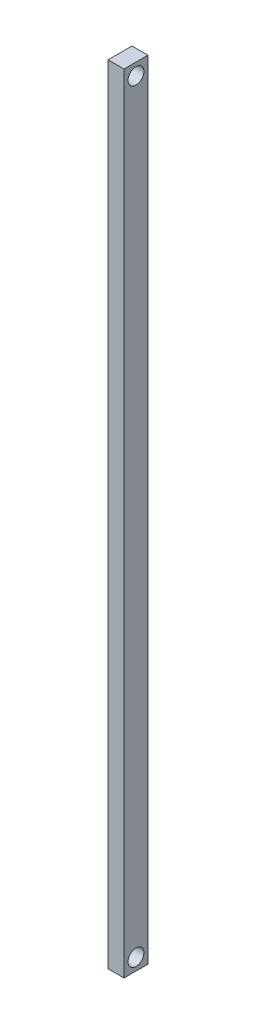
ISO-10303-21;
HEADER;
FILE_DESCRIPTION(('STEP AP214'),'2;1');
FILE_NAME('part.step','',(''),(''),'','','');
FILE_SCHEMA(('AUTOMOTIVE_DESIGN { 1 0 10303 214 1 1 1 1 }'));
ENDSEC;
DATA;
#1=APPLICATION_CONTEXT('core data for automotive mechanical design processes');
#2=APPLICATION_PROTOCOL_DEFINITION('international standard','automotive_design',2000,#1);
#3=PRODUCT_CONTEXT('',#1,'mechanical');
#4=PRODUCT('Part','Part','',(#3));
#5=PRODUCT_RELATED_PRODUCT_CATEGORY('part','',(#4));
#6=PRODUCT_DEFINITION_FORMATION('','',#4);
#7=PRODUCT_DEFINITION_CONTEXT('part definition',#1,'design');
#8=PRODUCT_DEFINITION('design','',#6,#7);
#9=PRODUCT_DEFINITION_SHAPE('','',#8);
#10=(LENGTH_UNIT() NAMED_UNIT(*) SI_UNIT(.MILLI.,.METRE.));
#11=(NAMED_UNIT(*) PLANE_ANGLE_UNIT() SI_UNIT($,.RADIAN.));
#12=(NAMED_UNIT(*) SI_UNIT($,.STERADIAN.) SOLID_ANGLE_UNIT());
#13=UNCERTAINTY_MEASURE_WITH_UNIT(LENGTH_MEASURE(1.E-05),#10,'distance_accuracy_value','');
#14=(GEOMETRIC_REPRESENTATION_CONTEXT(3) GLOBAL_UNCERTAINTY_ASSIGNED_CONTEXT((#13)) GLOBAL_UNIT_ASSIGNED_CONTEXT((#10,
#11,#12)) REPRESENTATION_CONTEXT('',''));
#15=CARTESIAN_POINT('',(0.,0.,0.));
#16=DIRECTION('',(0.,0.,1.));
#17=DIRECTION('',(1.,0.,0.));
#18=AXIS2_PLACEMENT_3D('',#15,#16,#17);
#19=CARTESIAN_POINT('',(10.,0.,15.));
#20=DIRECTION('',(0.,1.,0.));
#21=DIRECTION('',(0.,0.,1.));
#22=AXIS2_PLACEMENT_3D('',#19,#20,#21);
#23=PLANE('',#22);
#24=DIRECTION('',(0.,0.,-1.));
#25=VECTOR('',#24,1.);
#26=CARTESIAN_POINT('',(0.,0.,15.));
#27=LINE('',#26,#25);
#28=CARTESIAN_POINT('',(0.,0.,15.));
#29=VERTEX_POINT('',#28);
#30=CARTESIAN_POINT('',(0.,0.,0.));
#31=VERTEX_POINT('',#30);
#32=EDGE_CURVE('E105',#29,#31,#27,.T.);
#33=ORIENTED_EDGE('',*,*,#32,.T.);
#34=DIRECTION('',(-1.,0.,0.));
#35=VECTOR('',#34,1.);
#36=CARTESIAN_POINT('',(10.,0.,0.));
#37=LINE('',#36,#35);
#38=CARTESIAN_POINT('',(10.,0.,0.));
#39=VERTEX_POINT('',#38);
#40=EDGE_CURVE('E11',#39,#31,#37,.T.);
#41=ORIENTED_EDGE('',*,*,#40,.F.);
#42=DIRECTION('',(0.,0.,-1.));
#43=VECTOR('',#42,1.);
#44=CARTESIAN_POINT('',(10.,0.,15.));
#45=LINE('',#44,#43);
#46=CARTESIAN_POINT('',(10.,0.,15.));
#47=VERTEX_POINT('',#46);
#48=EDGE_CURVE('E89',#47,#39,#45,.T.);
#49=ORIENTED_EDGE('',*,*,#48,.F.);
#50=DIRECTION('',(-1.,0.,0.));
#51=VECTOR('',#50,1.);
#52=CARTESIAN_POINT('',(10.,0.,15.));
#53=LINE('',#52,#51);
#54=EDGE_CURVE('E98',#47,#29,#53,.T.);
#55=ORIENTED_EDGE('',*,*,#54,.T.);
#56=EDGE_LOOP('',(#33,#41,#49,#55));
#57=FACE_BOUND('',#56,.T.);
#58=ADVANCED_FACE('F39',(#57),#23,.F.);
#59=CARTESIAN_POINT('',(10.,0.,0.));
#60=DIRECTION('',(0.,0.,1.));
#61=DIRECTION('',(0.,-1.,0.));
#62=AXIS2_PLACEMENT_3D('',#59,#60,#61);
#63=PLANE('',#62);
#64=DIRECTION('',(0.,1.,0.));
#65=VECTOR('',#64,1.);
#66=CARTESIAN_POINT('',(0.,0.,0.));
#67=LINE('',#66,#65);
#68=CARTESIAN_POINT('',(0.,494.,1.20995103755759E-13));
#69=VERTEX_POINT('',#68);
#70=EDGE_CURVE('E94',#31,#69,#67,.T.);
#71=ORIENTED_EDGE('',*,*,#70,.T.);
#72=DIRECTION('',(-1.,0.,0.));
#73=VECTOR('',#72,1.);
#74=CARTESIAN_POINT('',(10.,494.,1.20995103755759E-13));
#75=LINE('',#74,#73);
#76=CARTESIAN_POINT('',(10.,494.,1.20995103755759E-13));
#77=VERTEX_POINT('',#76);
#78=EDGE_CURVE('E50',#77,#69,#75,.T.);
#79=ORIENTED_EDGE('',*,*,#78,.F.);
#80=DIRECTION('',(0.,1.,0.));
#81=VECTOR('',#80,1.);
#82=CARTESIAN_POINT('',(10.,0.,0.));
#83=LINE('',#82,#81);
#84=EDGE_CURVE('E85',#39,#77,#83,.T.);
#85=ORIENTED_EDGE('',*,*,#84,.F.);
#86=ORIENTED_EDGE('',*,*,#40,.T.);
#87=EDGE_LOOP('',(#71,#79,#85,#86));
#88=FACE_BOUND('',#87,.T.);
#89=ADVANCED_FACE('F91',(#88),#63,.F.);
#90=CARTESIAN_POINT('',(10.,494.,1.20995103755759E-13));
#91=DIRECTION('',(0.,-1.,0.));
#92=DIRECTION('',(0.,0.,-1.));
#93=AXIS2_PLACEMENT_3D('',#90,#91,#92);
#94=PLANE('',#93);
#95=DIRECTION('',(0.,0.,1.));
#96=VECTOR('',#95,1.);
#97=CARTESIAN_POINT('',(0.,494.,1.20995103755759E-13));
#98=LINE('',#97,#96);
#99=CARTESIAN_POINT('',(0.,494.,15.0000000000001));
#100=VERTEX_POINT('',#99);
#101=EDGE_CURVE('E75',#69,#100,#98,.T.);
#102=ORIENTED_EDGE('',*,*,#101,.T.);
#103=DIRECTION('',(-1.,0.,0.));
#104=VECTOR('',#103,1.);
#105=CARTESIAN_POINT('',(10.,494.,15.0000000000001));
#106=LINE('',#105,#104);
#107=CARTESIAN_POINT('',(10.,494.,15.0000000000001));
#108=VERTEX_POINT('',#107);
#109=EDGE_CURVE('E92',#108,#100,#106,.T.);
#110=ORIENTED_EDGE('',*,*,#109,.F.);
#111=DIRECTION('',(0.,0.,1.));
#112=VECTOR('',#111,1.);
#113=CARTESIAN_POINT('',(10.,494.,1.20995103755759E-13));
#114=LINE('',#113,#112);
#115=EDGE_CURVE('E86',#77,#108,#114,.T.);
#116=ORIENTED_EDGE('',*,*,#115,.F.);
#117=ORIENTED_EDGE('',*,*,#78,.T.);
#118=EDGE_LOOP('',(#102,#110,#116,#117));
#119=FACE_BOUND('',#118,.T.);
#120=ADVANCED_FACE('F96',(#119),#94,.F.);
#121=CARTESIAN_POINT('',(10.,494.,15.0000000000001));
#122=DIRECTION('',(0.,0.,-1.));
#123=DIRECTION('',(0.,1.,0.));
#124=AXIS2_PLACEMENT_3D('',#121,#122,#123);
#125=PLANE('',#124);
#126=DIRECTION('',(0.,-1.,0.));
#127=VECTOR('',#126,1.);
#128=CARTESIAN_POINT('',(0.,494.,15.0000000000001));
#129=LINE('',#128,#127);
#130=EDGE_CURVE('E77',#100,#29,#129,.T.);
#131=ORIENTED_EDGE('',*,*,#130,.T.);
#132=ORIENTED_EDGE('',*,*,#54,.F.);
#133=DIRECTION('',(0.,-1.,0.));
#134=VECTOR('',#133,1.);
#135=CARTESIAN_POINT('',(10.,494.,15.0000000000001));
#136=LINE('',#135,#134);
#137=EDGE_CURVE('E54',#108,#47,#136,.T.);
#138=ORIENTED_EDGE('',*,*,#137,.F.);
#139=ORIENTED_EDGE('',*,*,#109,.T.);
#140=EDGE_LOOP('',(#131,#132,#138,#139));
#141=FACE_BOUND('',#140,.T.);
#142=ADVANCED_FACE('F109',(#141),#125,.F.);
#143=CARTESIAN_POINT('',(10.,0.,0.));
#144=DIRECTION('',(1.,0.,0.));
#145=DIRECTION('',(0.,0.,-1.));
#146=AXIS2_PLACEMENT_3D('',#143,#144,#145);
#147=PLANE('',#146);
#148=CARTESIAN_POINT('',(10.,486.5,7.50000000000006));
#149=DIRECTION('',(1.,0.,0.));
#150=DIRECTION('',(0.,0.,-1.));
#151=AXIS2_PLACEMENT_3D('',#148,#149,#150);
#152=CIRCLE('',#151,4.99999999999999);
#153=CARTESIAN_POINT('',(10.,486.5,2.50000000000007));
#154=VERTEX_POINT('',#153);
#155=EDGE_CURVE('E122',#154,#154,#152,.T.);
#156=ORIENTED_EDGE('',*,*,#155,.F.);
#157=EDGE_LOOP('',(#156));
#158=FACE_BOUND('',#157,.T.);
#159=CARTESIAN_POINT('',(10.,7.50000000000002,7.50000000000007));
#160=DIRECTION('',(1.,0.,0.));
#161=DIRECTION('',(0.,0.,-1.));
#162=AXIS2_PLACEMENT_3D('',#159,#160,#161);
#163=CIRCLE('',#162,5.);
#164=CARTESIAN_POINT('',(10.,7.50000000000002,2.50000000000007));
#165=VERTEX_POINT('',#164);
#166=EDGE_CURVE('E104',#165,#165,#163,.T.);
#167=ORIENTED_EDGE('',*,*,#166,.F.);
#168=EDGE_LOOP('',(#167));
#169=FACE_BOUND('',#168,.T.);
#170=ORIENTED_EDGE('',*,*,#48,.T.);
#171=ORIENTED_EDGE('',*,*,#84,.T.);
#172=ORIENTED_EDGE('',*,*,#115,.T.);
#173=ORIENTED_EDGE('',*,*,#137,.T.);
#174=EDGE_LOOP('',(#170,#171,#172,#173));
#175=FACE_BOUND('',#174,.T.);
#176=ADVANCED_FACE('F88',(#158,#169,#175),#147,.T.);
#177=CARTESIAN_POINT('',(0.,0.,0.));
#178=DIRECTION('',(1.,0.,0.));
#179=DIRECTION('',(0.,0.,-1.));
#180=AXIS2_PLACEMENT_3D('',#177,#178,#179);
#181=PLANE('',#180);
#182=CARTESIAN_POINT('',(0.,486.5,7.50000000000006));
#183=DIRECTION('',(1.,0.,0.));
#184=DIRECTION('',(0.,0.,-1.));
#185=AXIS2_PLACEMENT_3D('',#182,#183,#184);
#186=CIRCLE('',#185,4.99999999999999);
#187=CARTESIAN_POINT('',(0.,486.5,2.50000000000007));
#188=VERTEX_POINT('',#187);
#189=EDGE_CURVE('E118',#188,#188,#186,.T.);
#190=ORIENTED_EDGE('',*,*,#189,.T.);
#191=EDGE_LOOP('',(#190));
#192=FACE_BOUND('',#191,.T.);
#193=CARTESIAN_POINT('',(0.,7.50000000000002,7.50000000000007));
#194=DIRECTION('',(1.,0.,0.));
#195=DIRECTION('',(0.,0.,-1.));
#196=AXIS2_PLACEMENT_3D('',#193,#194,#195);
#197=CIRCLE('',#196,5.);
#198=CARTESIAN_POINT('',(0.,7.50000000000002,2.50000000000007));
#199=VERTEX_POINT('',#198);
#200=EDGE_CURVE('E116',#199,#199,#197,.T.);
#201=ORIENTED_EDGE('',*,*,#200,.T.);
#202=EDGE_LOOP('',(#201));
#203=FACE_BOUND('',#202,.T.);
#204=ORIENTED_EDGE('',*,*,#32,.F.);
#205=ORIENTED_EDGE('',*,*,#130,.F.);
#206=ORIENTED_EDGE('',*,*,#101,.F.);
#207=ORIENTED_EDGE('',*,*,#70,.F.);
#208=EDGE_LOOP('',(#204,#205,#206,#207));
#209=FACE_BOUND('',#208,.T.);
#210=ADVANCED_FACE('F114',(#192,#203,#209),#181,.F.);
#211=CARTESIAN_POINT('',(10.,7.50000000000002,7.50000000000007));
#212=DIRECTION('',(-1.,0.,0.));
#213=DIRECTION('',(0.,0.,1.));
#214=AXIS2_PLACEMENT_3D('',#211,#212,#213);
#215=CYLINDRICAL_SURFACE('',#214,5.);
#216=ORIENTED_EDGE('',*,*,#166,.T.);
#217=EDGE_LOOP('',(#216));
#218=FACE_BOUND('',#217,.T.);
#219=ORIENTED_EDGE('',*,*,#200,.F.);
#220=EDGE_LOOP('',(#219));
#221=FACE_BOUND('',#220,.T.);
#222=ADVANCED_FACE('F132',(#218,#221),#215,.F.);
#223=CARTESIAN_POINT('',(0.,486.5,7.50000000000006));
#224=DIRECTION('',(1.,0.,0.));
#225=DIRECTION('',(0.,0.,-1.));
#226=AXIS2_PLACEMENT_3D('',#223,#224,#225);
#227=CYLINDRICAL_SURFACE('',#226,4.99999999999999);
#228=ORIENTED_EDGE('',*,*,#189,.F.);
#229=EDGE_LOOP('',(#228));
#230=FACE_BOUND('',#229,.T.);
#231=ORIENTED_EDGE('',*,*,#155,.T.);
#232=EDGE_LOOP('',(#231));
#233=FACE_BOUND('',#232,.T.);
#234=ADVANCED_FACE('F128',(#230,#233),#227,.F.);
#235=CLOSED_SHELL('',(#58,#89,#120,#142,#176,#210,#222,#234));
#236=MANIFOLD_SOLID_BREP('B2',#235);
#237=ADVANCED_BREP_SHAPE_REPRESENTATION('',(#18,#236),#14);
#238=SHAPE_DEFINITION_REPRESENTATION(#9,#237);
ENDSEC;
END-ISO-10303-21;
